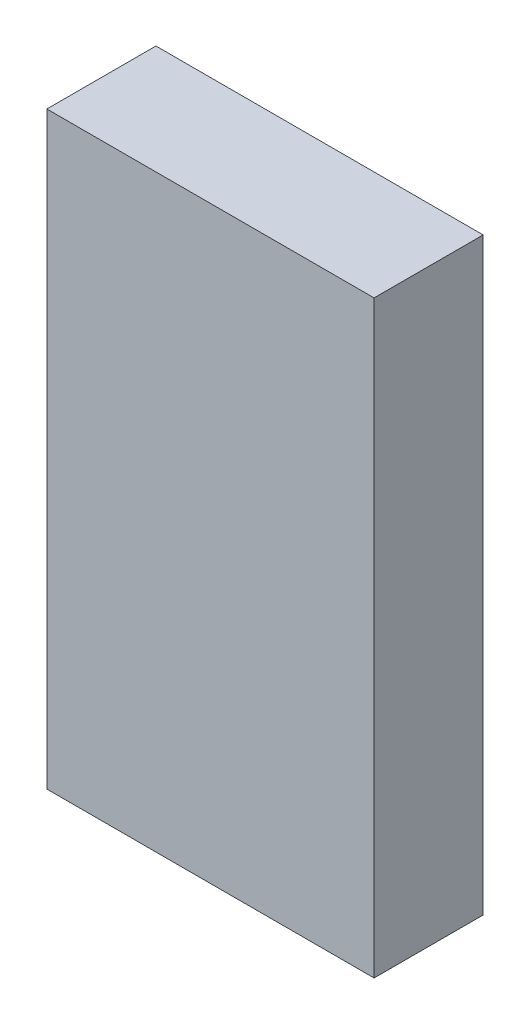
ISO-10303-21;
HEADER;
FILE_DESCRIPTION(('STEP AP214'),'2;1');
FILE_NAME('part.step','',(''),(''),'','','');
FILE_SCHEMA(('AUTOMOTIVE_DESIGN { 1 0 10303 214 1 1 1 1 }'));
ENDSEC;
DATA;
#1=APPLICATION_CONTEXT('core data for automotive mechanical design processes');
#2=APPLICATION_PROTOCOL_DEFINITION('international standard','automotive_design',2000,#1);
#3=PRODUCT_CONTEXT('',#1,'mechanical');
#4=PRODUCT('Part','Part','',(#3));
#5=PRODUCT_RELATED_PRODUCT_CATEGORY('part','',(#4));
#6=PRODUCT_DEFINITION_FORMATION('','',#4);
#7=PRODUCT_DEFINITION_CONTEXT('part definition',#1,'design');
#8=PRODUCT_DEFINITION('design','',#6,#7);
#9=PRODUCT_DEFINITION_SHAPE('','',#8);
#10=(LENGTH_UNIT() NAMED_UNIT(*) SI_UNIT(.MILLI.,.METRE.));
#11=(NAMED_UNIT(*) PLANE_ANGLE_UNIT() SI_UNIT($,.RADIAN.));
#12=(NAMED_UNIT(*) SI_UNIT($,.STERADIAN.) SOLID_ANGLE_UNIT());
#13=UNCERTAINTY_MEASURE_WITH_UNIT(LENGTH_MEASURE(1.E-05),#10,'distance_accuracy_value','');
#14=(GEOMETRIC_REPRESENTATION_CONTEXT(3) GLOBAL_UNCERTAINTY_ASSIGNED_CONTEXT((#13)) GLOBAL_UNIT_ASSIGNED_CONTEXT((#10,
#11,#12)) REPRESENTATION_CONTEXT('',''));
#15=CARTESIAN_POINT('',(0.,0.,0.));
#16=DIRECTION('',(0.,0.,1.));
#17=DIRECTION('',(1.,0.,0.));
#18=AXIS2_PLACEMENT_3D('',#15,#16,#17);
#19=CARTESIAN_POINT('',(0.,0.,5.));
#20=DIRECTION('',(1.,0.,0.));
#21=DIRECTION('',(0.,0.,-1.));
#22=AXIS2_PLACEMENT_3D('',#19,#20,#21);
#23=PLANE('',#22);
#24=DIRECTION('',(0.,-1.,0.));
#25=VECTOR('',#24,1.);
#26=CARTESIAN_POINT('',(0.,0.,0.));
#27=LINE('',#26,#25);
#28=CARTESIAN_POINT('',(0.,27.,0.));
#29=VERTEX_POINT('',#28);
#30=CARTESIAN_POINT('',(0.,0.,0.));
#31=VERTEX_POINT('',#30);
#32=EDGE_CURVE('E98',#29,#31,#27,.T.);
#33=ORIENTED_EDGE('',*,*,#32,.T.);
#34=DIRECTION('',(0.,0.,-1.));
#35=VECTOR('',#34,1.);
#36=CARTESIAN_POINT('',(0.,0.,5.));
#37=LINE('',#36,#35);
#38=CARTESIAN_POINT('',(0.,0.,5.));
#39=VERTEX_POINT('',#38);
#40=EDGE_CURVE('E11',#39,#31,#37,.T.);
#41=ORIENTED_EDGE('',*,*,#40,.F.);
#42=DIRECTION('',(0.,-1.,0.));
#43=VECTOR('',#42,1.);
#44=CARTESIAN_POINT('',(0.,0.,5.));
#45=LINE('',#44,#43);
#46=CARTESIAN_POINT('',(0.,27.,5.));
#47=VERTEX_POINT('',#46);
#48=EDGE_CURVE('E86',#47,#39,#45,.T.);
#49=ORIENTED_EDGE('',*,*,#48,.F.);
#50=DIRECTION('',(0.,0.,-1.));
#51=VECTOR('',#50,1.);
#52=CARTESIAN_POINT('',(0.,27.,5.));
#53=LINE('',#52,#51);
#54=EDGE_CURVE('E94',#47,#29,#53,.T.);
#55=ORIENTED_EDGE('',*,*,#54,.T.);
#56=EDGE_LOOP('',(#33,#41,#49,#55));
#57=FACE_BOUND('',#56,.T.);
#58=ADVANCED_FACE('F35',(#57),#23,.F.);
#59=CARTESIAN_POINT('',(0.,0.,5.));
#60=DIRECTION('',(0.,1.,0.));
#61=DIRECTION('',(0.,0.,1.));
#62=AXIS2_PLACEMENT_3D('',#59,#60,#61);
#63=PLANE('',#62);
#64=DIRECTION('',(1.,0.,0.));
#65=VECTOR('',#64,1.);
#66=CARTESIAN_POINT('',(0.,0.,0.));
#67=LINE('',#66,#65);
#68=CARTESIAN_POINT('',(15.,0.,0.));
#69=VERTEX_POINT('',#68);
#70=EDGE_CURVE('E90',#31,#69,#67,.T.);
#71=ORIENTED_EDGE('',*,*,#70,.T.);
#72=DIRECTION('',(0.,0.,-1.));
#73=VECTOR('',#72,1.);
#74=CARTESIAN_POINT('',(15.,0.,5.));
#75=LINE('',#74,#73);
#76=CARTESIAN_POINT('',(15.,0.,5.));
#77=VERTEX_POINT('',#76);
#78=EDGE_CURVE('E43',#77,#69,#75,.T.);
#79=ORIENTED_EDGE('',*,*,#78,.F.);
#80=DIRECTION('',(1.,0.,0.));
#81=VECTOR('',#80,1.);
#82=CARTESIAN_POINT('',(0.,0.,5.));
#83=LINE('',#82,#81);
#84=EDGE_CURVE('E81',#39,#77,#83,.T.);
#85=ORIENTED_EDGE('',*,*,#84,.F.);
#86=ORIENTED_EDGE('',*,*,#40,.T.);
#87=EDGE_LOOP('',(#71,#79,#85,#86));
#88=FACE_BOUND('',#87,.T.);
#89=ADVANCED_FACE('F89',(#88),#63,.F.);
#90=CARTESIAN_POINT('',(15.,0.,5.));
#91=DIRECTION('',(-1.,0.,0.));
#92=DIRECTION('',(0.,0.,1.));
#93=AXIS2_PLACEMENT_3D('',#90,#91,#92);
#94=PLANE('',#93);
#95=DIRECTION('',(0.,1.,0.));
#96=VECTOR('',#95,1.);
#97=CARTESIAN_POINT('',(15.,0.,0.));
#98=LINE('',#97,#96);
#99=CARTESIAN_POINT('',(15.,27.,0.));
#100=VERTEX_POINT('',#99);
#101=EDGE_CURVE('E68',#69,#100,#98,.T.);
#102=ORIENTED_EDGE('',*,*,#101,.T.);
#103=DIRECTION('',(0.,0.,-1.));
#104=VECTOR('',#103,1.);
#105=CARTESIAN_POINT('',(15.,27.,5.));
#106=LINE('',#105,#104);
#107=CARTESIAN_POINT('',(15.,27.,5.));
#108=VERTEX_POINT('',#107);
#109=EDGE_CURVE('E91',#108,#100,#106,.T.);
#110=ORIENTED_EDGE('',*,*,#109,.F.);
#111=DIRECTION('',(0.,1.,0.));
#112=VECTOR('',#111,1.);
#113=CARTESIAN_POINT('',(15.,0.,5.));
#114=LINE('',#113,#112);
#115=EDGE_CURVE('E84',#77,#108,#114,.T.);
#116=ORIENTED_EDGE('',*,*,#115,.F.);
#117=ORIENTED_EDGE('',*,*,#78,.T.);
#118=EDGE_LOOP('',(#102,#110,#116,#117));
#119=FACE_BOUND('',#118,.T.);
#120=ADVANCED_FACE('F92',(#119),#94,.F.);
#121=CARTESIAN_POINT('',(0.,27.,5.));
#122=DIRECTION('',(0.,-1.,0.));
#123=DIRECTION('',(0.,0.,-1.));
#124=AXIS2_PLACEMENT_3D('',#121,#122,#123);
#125=PLANE('',#124);
#126=DIRECTION('',(-1.,0.,0.));
#127=VECTOR('',#126,1.);
#128=CARTESIAN_POINT('',(0.,27.,0.));
#129=LINE('',#128,#127);
#130=EDGE_CURVE('E74',#100,#29,#129,.T.);
#131=ORIENTED_EDGE('',*,*,#130,.T.);
#132=ORIENTED_EDGE('',*,*,#54,.F.);
#133=DIRECTION('',(-1.,0.,0.));
#134=VECTOR('',#133,1.);
#135=CARTESIAN_POINT('',(0.,27.,5.));
#136=LINE('',#135,#134);
#137=EDGE_CURVE('E51',#108,#47,#136,.T.);
#138=ORIENTED_EDGE('',*,*,#137,.F.);
#139=ORIENTED_EDGE('',*,*,#109,.T.);
#140=EDGE_LOOP('',(#131,#132,#138,#139));
#141=FACE_BOUND('',#140,.T.);
#142=ADVANCED_FACE('F105',(#141),#125,.F.);
#143=CARTESIAN_POINT('',(0.,0.,5.));
#144=DIRECTION('',(0.,0.,-1.));
#145=DIRECTION('',(-1.,0.,0.));
#146=AXIS2_PLACEMENT_3D('',#143,#144,#145);
#147=PLANE('',#146);
#148=ORIENTED_EDGE('',*,*,#48,.T.);
#149=ORIENTED_EDGE('',*,*,#84,.T.);
#150=ORIENTED_EDGE('',*,*,#115,.T.);
#151=ORIENTED_EDGE('',*,*,#137,.T.);
#152=EDGE_LOOP('',(#148,#149,#150,#151));
#153=FACE_BOUND('',#152,.T.);
#154=ADVANCED_FACE('F82',(#153),#147,.F.);
#155=CARTESIAN_POINT('',(0.,0.,0.));
#156=DIRECTION('',(0.,0.,-1.));
#157=DIRECTION('',(-1.,0.,0.));
#158=AXIS2_PLACEMENT_3D('',#155,#156,#157);
#159=PLANE('',#158);
#160=ORIENTED_EDGE('',*,*,#32,.F.);
#161=ORIENTED_EDGE('',*,*,#130,.F.);
#162=ORIENTED_EDGE('',*,*,#101,.F.);
#163=ORIENTED_EDGE('',*,*,#70,.F.);
#164=EDGE_LOOP('',(#160,#161,#162,#163));
#165=FACE_BOUND('',#164,.T.);
#166=ADVANCED_FACE('F108',(#165),#159,.T.);
#167=CLOSED_SHELL('',(#58,#89,#120,#142,#154,#166));
#168=MANIFOLD_SOLID_BREP('B2',#167);
#169=ADVANCED_BREP_SHAPE_REPRESENTATION('',(#18,#168),#14);
#170=SHAPE_DEFINITION_REPRESENTATION(#9,#169);
ENDSEC;
END-ISO-10303-21;
